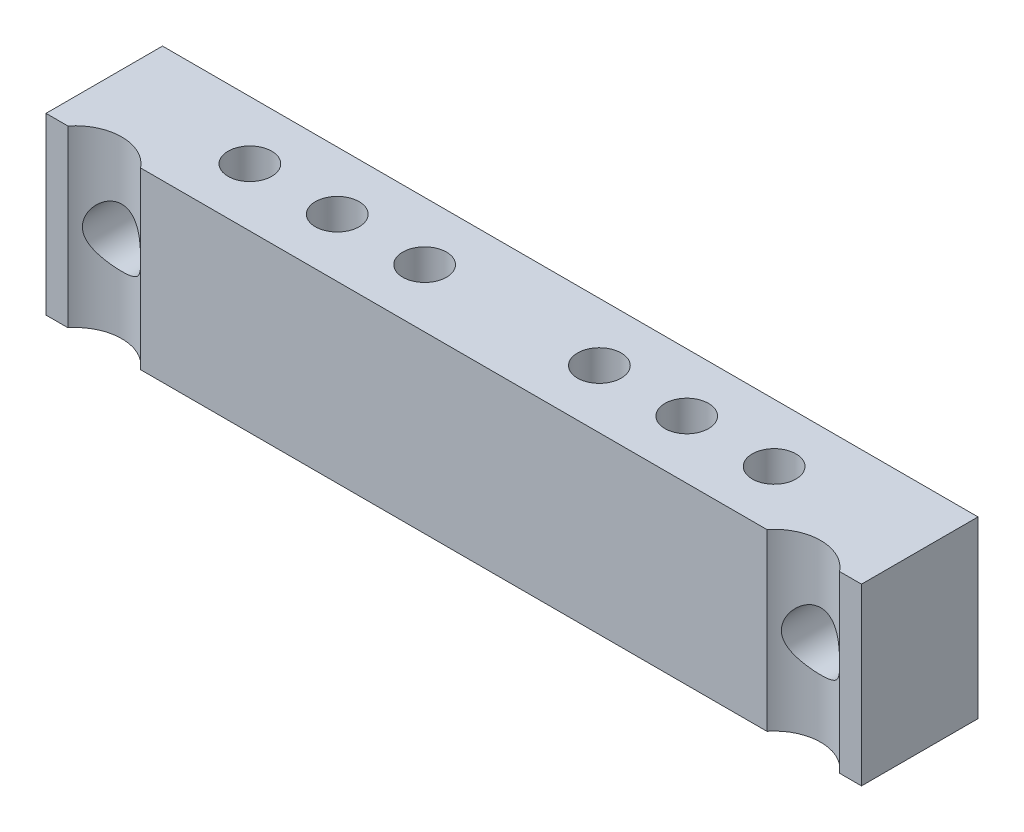
ISO-10303-21;
HEADER;
FILE_DESCRIPTION(('STEP AP214'),'2;1');
FILE_NAME('part.step','',(''),(''),'','','');
FILE_SCHEMA(('AUTOMOTIVE_DESIGN { 1 0 10303 214 1 1 1 1 }'));
ENDSEC;
DATA;
#1=APPLICATION_CONTEXT('core data for automotive mechanical design processes');
#2=APPLICATION_PROTOCOL_DEFINITION('international standard','automotive_design',2000,#1);
#3=PRODUCT_CONTEXT('',#1,'mechanical');
#4=PRODUCT('Part','Part','',(#3));
#5=PRODUCT_RELATED_PRODUCT_CATEGORY('part','',(#4));
#6=PRODUCT_DEFINITION_FORMATION('','',#4);
#7=PRODUCT_DEFINITION_CONTEXT('part definition',#1,'design');
#8=PRODUCT_DEFINITION('design','',#6,#7);
#9=PRODUCT_DEFINITION_SHAPE('','',#8);
#10=(LENGTH_UNIT() NAMED_UNIT(*) SI_UNIT(.MILLI.,.METRE.));
#11=(NAMED_UNIT(*) PLANE_ANGLE_UNIT() SI_UNIT($,.RADIAN.));
#12=(NAMED_UNIT(*) SI_UNIT($,.STERADIAN.) SOLID_ANGLE_UNIT());
#13=UNCERTAINTY_MEASURE_WITH_UNIT(LENGTH_MEASURE(1.E-05),#10,'distance_accuracy_value','');
#14=(GEOMETRIC_REPRESENTATION_CONTEXT(3) GLOBAL_UNCERTAINTY_ASSIGNED_CONTEXT((#13)) GLOBAL_UNIT_ASSIGNED_CONTEXT((#10,
#11,#12)) REPRESENTATION_CONTEXT('',''));
#15=CARTESIAN_POINT('',(0.,0.,0.));
#16=DIRECTION('',(0.,0.,1.));
#17=DIRECTION('',(1.,0.,0.));
#18=AXIS2_PLACEMENT_3D('',#15,#16,#17);
#19=CARTESIAN_POINT('',(0.,0.,4.));
#20=DIRECTION('',(0.,0.,-1.));
#21=DIRECTION('',(-1.,0.,0.));
#22=AXIS2_PLACEMENT_3D('',#19,#20,#21);
#23=PLANE('',#22);
#24=DIRECTION('',(-1.,0.,0.));
#25=VECTOR('',#24,1.);
#26=CARTESIAN_POINT('',(0.,6.,4.));
#27=LINE('',#26,#25);
#28=CARTESIAN_POINT('',(24.7510004003203,6.,4.));
#29=VERTEX_POINT('',#28);
#30=CARTESIAN_POINT('',(3.24899959967968,6.,4.));
#31=VERTEX_POINT('',#30);
#32=EDGE_CURVE('E119',#29,#31,#27,.T.);
#33=ORIENTED_EDGE('',*,*,#32,.T.);
#34=DIRECTION('',(0.,-1.,0.));
#35=VECTOR('',#34,1.);
#36=CARTESIAN_POINT('',(3.24899959967968,6.,4.));
#37=LINE('',#36,#35);
#38=CARTESIAN_POINT('',(3.24899959967968,0.,4.));
#39=VERTEX_POINT('',#38);
#40=EDGE_CURVE('E57',#31,#39,#37,.T.);
#41=ORIENTED_EDGE('',*,*,#40,.T.);
#42=DIRECTION('',(1.,0.,0.));
#43=VECTOR('',#42,1.);
#44=CARTESIAN_POINT('',(0.,0.,4.));
#45=LINE('',#44,#43);
#46=CARTESIAN_POINT('',(24.7510004003203,0.,4.));
#47=VERTEX_POINT('',#46);
#48=EDGE_CURVE('E121',#39,#47,#45,.T.);
#49=ORIENTED_EDGE('',*,*,#48,.T.);
#50=DIRECTION('',(0.,-1.,0.));
#51=VECTOR('',#50,1.);
#52=CARTESIAN_POINT('',(24.7510004003203,6.,4.));
#53=LINE('',#52,#51);
#54=EDGE_CURVE('E107',#47,#29,#53,.F.);
#55=ORIENTED_EDGE('',*,*,#54,.T.);
#56=EDGE_LOOP('',(#33,#41,#49,#55));
#57=FACE_BOUND('',#56,.T.);
#58=ADVANCED_FACE('F35',(#57),#23,.F.);
#59=CARTESIAN_POINT('',(28.,6.,4.));
#60=VERTEX_POINT('',#59);
#61=CARTESIAN_POINT('',(27.2489995996797,6.,4.));
#62=VERTEX_POINT('',#61);
#63=EDGE_CURVE('E127',#60,#62,#27,.T.);
#64=ORIENTED_EDGE('',*,*,#63,.T.);
#65=DIRECTION('',(0.,-1.,0.));
#66=VECTOR('',#65,1.);
#67=CARTESIAN_POINT('',(27.2489995996797,6.,4.));
#68=LINE('',#67,#66);
#69=CARTESIAN_POINT('',(27.2489995996797,0.,4.));
#70=VERTEX_POINT('',#69);
#71=EDGE_CURVE('E65',#62,#70,#68,.T.);
#72=ORIENTED_EDGE('',*,*,#71,.T.);
#73=CARTESIAN_POINT('',(28.,0.,4.));
#74=VERTEX_POINT('',#73);
#75=EDGE_CURVE('E215',#70,#74,#45,.T.);
#76=ORIENTED_EDGE('',*,*,#75,.T.);
#77=DIRECTION('',(0.,1.,0.));
#78=VECTOR('',#77,1.);
#79=CARTESIAN_POINT('',(28.,0.,4.));
#80=LINE('',#79,#78);
#81=EDGE_CURVE('E131',#74,#60,#80,.T.);
#82=ORIENTED_EDGE('',*,*,#81,.T.);
#83=EDGE_LOOP('',(#64,#72,#76,#82));
#84=FACE_BOUND('',#83,.T.);
#85=ADVANCED_FACE('F191',(#84),#23,.F.);
#86=CARTESIAN_POINT('',(0.,0.,4.));
#87=VERTEX_POINT('',#86);
#88=CARTESIAN_POINT('',(0.751000400320319,0.,4.));
#89=VERTEX_POINT('',#88);
#90=EDGE_CURVE('E209',#87,#89,#45,.T.);
#91=ORIENTED_EDGE('',*,*,#90,.T.);
#92=DIRECTION('',(0.,-1.,0.));
#93=VECTOR('',#92,1.);
#94=CARTESIAN_POINT('',(0.751000400320319,6.,4.));
#95=LINE('',#94,#93);
#96=CARTESIAN_POINT('',(0.751000400320319,6.,4.));
#97=VERTEX_POINT('',#96);
#98=EDGE_CURVE('E210',#89,#97,#95,.F.);
#99=ORIENTED_EDGE('',*,*,#98,.T.);
#100=CARTESIAN_POINT('',(0.,6.,4.));
#101=VERTEX_POINT('',#100);
#102=EDGE_CURVE('E128',#97,#101,#27,.T.);
#103=ORIENTED_EDGE('',*,*,#102,.T.);
#104=DIRECTION('',(0.,-1.,0.));
#105=VECTOR('',#104,1.);
#106=CARTESIAN_POINT('',(0.,0.,4.));
#107=LINE('',#106,#105);
#108=EDGE_CURVE('E145',#101,#87,#107,.T.);
#109=ORIENTED_EDGE('',*,*,#108,.T.);
#110=EDGE_LOOP('',(#91,#99,#103,#109));
#111=FACE_BOUND('',#110,.T.);
#112=ADVANCED_FACE('F193',(#111),#23,.F.);
#113=CARTESIAN_POINT('',(0.,0.,0.));
#114=DIRECTION('',(0.,0.,-1.));
#115=DIRECTION('',(-1.,0.,0.));
#116=AXIS2_PLACEMENT_3D('',#113,#114,#115);
#117=PLANE('',#116);
#118=CARTESIAN_POINT('',(2.,3.,0.));
#119=DIRECTION('',(0.,0.,1.));
#120=DIRECTION('',(1.,0.,0.));
#121=AXIS2_PLACEMENT_3D('',#118,#119,#120);
#122=CIRCLE('',#121,1.);
#123=CARTESIAN_POINT('',(3.,3.,0.));
#124=VERTEX_POINT('',#123);
#125=EDGE_CURVE('E139',#124,#124,#122,.T.);
#126=ORIENTED_EDGE('',*,*,#125,.T.);
#127=EDGE_LOOP('',(#126));
#128=FACE_BOUND('',#127,.T.);
#129=DIRECTION('',(0.,-1.,0.));
#130=VECTOR('',#129,1.);
#131=CARTESIAN_POINT('',(0.,0.,0.));
#132=LINE('',#131,#130);
#133=CARTESIAN_POINT('',(0.,6.,0.));
#134=VERTEX_POINT('',#133);
#135=CARTESIAN_POINT('',(0.,0.,0.));
#136=VERTEX_POINT('',#135);
#137=EDGE_CURVE('E135',#134,#136,#132,.T.);
#138=ORIENTED_EDGE('',*,*,#137,.F.);
#139=DIRECTION('',(-1.,0.,0.));
#140=VECTOR('',#139,1.);
#141=CARTESIAN_POINT('',(0.,6.,0.));
#142=LINE('',#141,#140);
#143=CARTESIAN_POINT('',(28.,6.,0.));
#144=VERTEX_POINT('',#143);
#145=EDGE_CURVE('E143',#144,#134,#142,.T.);
#146=ORIENTED_EDGE('',*,*,#145,.F.);
#147=DIRECTION('',(0.,1.,0.));
#148=VECTOR('',#147,1.);
#149=CARTESIAN_POINT('',(28.,0.,0.));
#150=LINE('',#149,#148);
#151=CARTESIAN_POINT('',(28.,0.,0.));
#152=VERTEX_POINT('',#151);
#153=EDGE_CURVE('E141',#152,#144,#150,.T.);
#154=ORIENTED_EDGE('',*,*,#153,.F.);
#155=DIRECTION('',(1.,0.,0.));
#156=VECTOR('',#155,1.);
#157=CARTESIAN_POINT('',(0.,0.,0.));
#158=LINE('',#157,#156);
#159=EDGE_CURVE('E138',#136,#152,#158,.T.);
#160=ORIENTED_EDGE('',*,*,#159,.F.);
#161=EDGE_LOOP('',(#138,#146,#154,#160));
#162=FACE_BOUND('',#161,.T.);
#163=CARTESIAN_POINT('',(26.,3.,0.));
#164=DIRECTION('',(0.,0.,1.));
#165=DIRECTION('',(-1.,0.,0.));
#166=AXIS2_PLACEMENT_3D('',#163,#164,#165);
#167=CIRCLE('',#166,1.);
#168=CARTESIAN_POINT('',(25.,3.,0.));
#169=VERTEX_POINT('',#168);
#170=EDGE_CURVE('E222',#169,#169,#167,.T.);
#171=ORIENTED_EDGE('',*,*,#170,.T.);
#172=EDGE_LOOP('',(#171));
#173=FACE_BOUND('',#172,.T.);
#174=ADVANCED_FACE('F200',(#128,#162,#173),#117,.T.);
#175=CARTESIAN_POINT('',(0.,0.,4.));
#176=DIRECTION('',(1.,0.,0.));
#177=DIRECTION('',(0.,0.,-1.));
#178=AXIS2_PLACEMENT_3D('',#175,#176,#177);
#179=PLANE('',#178);
#180=ORIENTED_EDGE('',*,*,#137,.T.);
#181=DIRECTION('',(0.,0.,-1.));
#182=VECTOR('',#181,1.);
#183=CARTESIAN_POINT('',(0.,0.,4.));
#184=LINE('',#183,#182);
#185=EDGE_CURVE('E11',#87,#136,#184,.T.);
#186=ORIENTED_EDGE('',*,*,#185,.F.);
#187=ORIENTED_EDGE('',*,*,#108,.F.);
#188=DIRECTION('',(0.,0.,-1.));
#189=VECTOR('',#188,1.);
#190=CARTESIAN_POINT('',(0.,6.,4.));
#191=LINE('',#190,#189);
#192=EDGE_CURVE('E130',#101,#134,#191,.T.);
#193=ORIENTED_EDGE('',*,*,#192,.T.);
#194=EDGE_LOOP('',(#180,#186,#187,#193));
#195=FACE_BOUND('',#194,.T.);
#196=ADVANCED_FACE('F37',(#195),#179,.F.);
#197=CARTESIAN_POINT('',(0.,0.,4.));
#198=DIRECTION('',(0.,1.,0.));
#199=DIRECTION('',(0.,0.,1.));
#200=AXIS2_PLACEMENT_3D('',#197,#198,#199);
#201=PLANE('',#200);
#202=CARTESIAN_POINT('',(17.,0.,2.));
#203=DIRECTION('',(0.,-1.,0.));
#204=DIRECTION('',(0.,0.,1.));
#205=AXIS2_PLACEMENT_3D('',#202,#203,#204);
#206=CIRCLE('',#205,0.750000000000002);
#207=CARTESIAN_POINT('',(17.,0.,2.75));
#208=VERTEX_POINT('',#207);
#209=EDGE_CURVE('E113',#208,#208,#206,.T.);
#210=ORIENTED_EDGE('',*,*,#209,.F.);
#211=EDGE_LOOP('',(#210));
#212=FACE_BOUND('',#211,.T.);
#213=CARTESIAN_POINT('',(20.,0.,1.99999999999998));
#214=DIRECTION('',(0.,-1.,0.));
#215=DIRECTION('',(0.,0.,1.));
#216=AXIS2_PLACEMENT_3D('',#213,#214,#215);
#217=CIRCLE('',#216,0.750000000000002);
#218=CARTESIAN_POINT('',(20.,0.,2.74999999999998));
#219=VERTEX_POINT('',#218);
#220=EDGE_CURVE('E260',#219,#219,#217,.T.);
#221=ORIENTED_EDGE('',*,*,#220,.F.);
#222=EDGE_LOOP('',(#221));
#223=FACE_BOUND('',#222,.T.);
#224=CARTESIAN_POINT('',(5.,0.,1.99999999999996));
#225=DIRECTION('',(0.,-1.,0.));
#226=DIRECTION('',(0.,0.,-1.));
#227=AXIS2_PLACEMENT_3D('',#224,#225,#226);
#228=CIRCLE('',#227,0.75);
#229=CARTESIAN_POINT('',(5.,0.,1.24999999999996));
#230=VERTEX_POINT('',#229);
#231=EDGE_CURVE('E228',#230,#230,#228,.T.);
#232=ORIENTED_EDGE('',*,*,#231,.F.);
#233=EDGE_LOOP('',(#232));
#234=FACE_BOUND('',#233,.T.);
#235=CARTESIAN_POINT('',(8.,0.,1.99999999999998));
#236=DIRECTION('',(0.,-1.,0.));
#237=DIRECTION('',(0.,0.,-1.));
#238=AXIS2_PLACEMENT_3D('',#235,#236,#237);
#239=CIRCLE('',#238,0.75);
#240=CARTESIAN_POINT('',(8.,0.,1.24999999999998));
#241=VERTEX_POINT('',#240);
#242=EDGE_CURVE('E235',#241,#241,#239,.T.);
#243=ORIENTED_EDGE('',*,*,#242,.F.);
#244=EDGE_LOOP('',(#243));
#245=FACE_BOUND('',#244,.T.);
#246=CARTESIAN_POINT('',(23.,0.,1.99999999999996));
#247=DIRECTION('',(0.,-1.,0.));
#248=DIRECTION('',(0.,0.,1.));
#249=AXIS2_PLACEMENT_3D('',#246,#247,#248);
#250=CIRCLE('',#249,0.750000000000002);
#251=CARTESIAN_POINT('',(23.,0.,2.74999999999996));
#252=VERTEX_POINT('',#251);
#253=EDGE_CURVE('E241',#252,#252,#250,.T.);
#254=ORIENTED_EDGE('',*,*,#253,.F.);
#255=EDGE_LOOP('',(#254));
#256=FACE_BOUND('',#255,.T.);
#257=CARTESIAN_POINT('',(11.,0.,2.));
#258=DIRECTION('',(0.,-1.,0.));
#259=DIRECTION('',(0.,0.,-1.));
#260=AXIS2_PLACEMENT_3D('',#257,#258,#259);
#261=CIRCLE('',#260,0.75);
#262=CARTESIAN_POINT('',(11.,0.,1.25));
#263=VERTEX_POINT('',#262);
#264=EDGE_CURVE('E247',#263,#263,#261,.T.);
#265=ORIENTED_EDGE('',*,*,#264,.F.);
#266=EDGE_LOOP('',(#265));
#267=FACE_BOUND('',#266,.T.);
#268=ORIENTED_EDGE('',*,*,#48,.F.);
#269=CARTESIAN_POINT('',(2.,0.,5.));
#270=DIRECTION('',(0.,-1.,0.));
#271=DIRECTION('',(0.,0.,-1.));
#272=AXIS2_PLACEMENT_3D('',#269,#270,#271);
#273=CIRCLE('',#272,1.6);
#274=EDGE_CURVE('E253',#89,#39,#273,.T.);
#275=ORIENTED_EDGE('',*,*,#274,.F.);
#276=ORIENTED_EDGE('',*,*,#90,.F.);
#277=ORIENTED_EDGE('',*,*,#185,.T.);
#278=ORIENTED_EDGE('',*,*,#159,.T.);
#279=DIRECTION('',(0.,0.,-1.));
#280=VECTOR('',#279,1.);
#281=CARTESIAN_POINT('',(28.,0.,4.));
#282=LINE('',#281,#280);
#283=EDGE_CURVE('E49',#74,#152,#282,.T.);
#284=ORIENTED_EDGE('',*,*,#283,.F.);
#285=ORIENTED_EDGE('',*,*,#75,.F.);
#286=CARTESIAN_POINT('',(26.,0.,5.));
#287=DIRECTION('',(0.,-1.,0.));
#288=DIRECTION('',(0.,0.,1.));
#289=AXIS2_PLACEMENT_3D('',#286,#287,#288);
#290=CIRCLE('',#289,1.6);
#291=EDGE_CURVE('E114',#47,#70,#290,.T.);
#292=ORIENTED_EDGE('',*,*,#291,.F.);
#293=EDGE_LOOP('',(#268,#275,#276,#277,#278,#284,#285,#292));
#294=FACE_BOUND('',#293,.T.);
#295=ADVANCED_FACE('F266',(#212,#223,#234,#245,#256,#267,#294),#201,.F.);
#296=CARTESIAN_POINT('',(28.,0.,4.));
#297=DIRECTION('',(-1.,0.,0.));
#298=DIRECTION('',(0.,0.,1.));
#299=AXIS2_PLACEMENT_3D('',#296,#297,#298);
#300=PLANE('',#299);
#301=ORIENTED_EDGE('',*,*,#153,.T.);
#302=DIRECTION('',(0.,0.,-1.));
#303=VECTOR('',#302,1.);
#304=CARTESIAN_POINT('',(28.,6.,4.));
#305=LINE('',#304,#303);
#306=EDGE_CURVE('E148',#60,#144,#305,.T.);
#307=ORIENTED_EDGE('',*,*,#306,.F.);
#308=ORIENTED_EDGE('',*,*,#81,.F.);
#309=ORIENTED_EDGE('',*,*,#283,.T.);
#310=EDGE_LOOP('',(#301,#307,#308,#309));
#311=FACE_BOUND('',#310,.T.);
#312=ADVANCED_FACE('F277',(#311),#300,.F.);
#313=CARTESIAN_POINT('',(0.,6.,4.));
#314=DIRECTION('',(0.,-1.,0.));
#315=DIRECTION('',(1.,0.,0.));
#316=AXIS2_PLACEMENT_3D('',#313,#314,#315);
#317=PLANE('',#316);
#318=CARTESIAN_POINT('',(17.,6.,2.));
#319=DIRECTION('',(0.,-1.,0.));
#320=DIRECTION('',(0.,0.,1.));
#321=AXIS2_PLACEMENT_3D('',#318,#319,#320);
#322=CIRCLE('',#321,0.750000000000002);
#323=CARTESIAN_POINT('',(17.,6.,2.75));
#324=VERTEX_POINT('',#323);
#325=EDGE_CURVE('E257',#324,#324,#322,.T.);
#326=ORIENTED_EDGE('',*,*,#325,.T.);
#327=EDGE_LOOP('',(#326));
#328=FACE_BOUND('',#327,.T.);
#329=CARTESIAN_POINT('',(20.,6.,1.99999999999998));
#330=DIRECTION('',(0.,-1.,0.));
#331=DIRECTION('',(0.,0.,1.));
#332=AXIS2_PLACEMENT_3D('',#329,#330,#331);
#333=CIRCLE('',#332,0.750000000000002);
#334=CARTESIAN_POINT('',(20.,6.,2.74999999999998));
#335=VERTEX_POINT('',#334);
#336=EDGE_CURVE('E232',#335,#335,#333,.T.);
#337=ORIENTED_EDGE('',*,*,#336,.T.);
#338=EDGE_LOOP('',(#337));
#339=FACE_BOUND('',#338,.T.);
#340=CARTESIAN_POINT('',(5.,6.,1.99999999999996));
#341=DIRECTION('',(0.,-1.,0.));
#342=DIRECTION('',(0.,0.,-1.));
#343=AXIS2_PLACEMENT_3D('',#340,#341,#342);
#344=CIRCLE('',#343,0.75);
#345=CARTESIAN_POINT('',(5.,6.,1.24999999999996));
#346=VERTEX_POINT('',#345);
#347=EDGE_CURVE('E231',#346,#346,#344,.T.);
#348=ORIENTED_EDGE('',*,*,#347,.T.);
#349=EDGE_LOOP('',(#348));
#350=FACE_BOUND('',#349,.T.);
#351=CARTESIAN_POINT('',(8.,6.,1.99999999999998));
#352=DIRECTION('',(0.,-1.,0.));
#353=DIRECTION('',(0.,0.,-1.));
#354=AXIS2_PLACEMENT_3D('',#351,#352,#353);
#355=CIRCLE('',#354,0.75);
#356=CARTESIAN_POINT('',(8.,6.,1.24999999999998));
#357=VERTEX_POINT('',#356);
#358=EDGE_CURVE('E238',#357,#357,#355,.T.);
#359=ORIENTED_EDGE('',*,*,#358,.T.);
#360=EDGE_LOOP('',(#359));
#361=FACE_BOUND('',#360,.T.);
#362=CARTESIAN_POINT('',(23.,6.,1.99999999999996));
#363=DIRECTION('',(0.,-1.,0.));
#364=DIRECTION('',(0.,0.,1.));
#365=AXIS2_PLACEMENT_3D('',#362,#363,#364);
#366=CIRCLE('',#365,0.750000000000002);
#367=CARTESIAN_POINT('',(23.,6.,2.74999999999996));
#368=VERTEX_POINT('',#367);
#369=EDGE_CURVE('E244',#368,#368,#366,.T.);
#370=ORIENTED_EDGE('',*,*,#369,.T.);
#371=EDGE_LOOP('',(#370));
#372=FACE_BOUND('',#371,.T.);
#373=CARTESIAN_POINT('',(11.,6.,2.));
#374=DIRECTION('',(0.,-1.,0.));
#375=DIRECTION('',(0.,0.,-1.));
#376=AXIS2_PLACEMENT_3D('',#373,#374,#375);
#377=CIRCLE('',#376,0.75);
#378=CARTESIAN_POINT('',(11.,6.,1.25));
#379=VERTEX_POINT('',#378);
#380=EDGE_CURVE('E250',#379,#379,#377,.T.);
#381=ORIENTED_EDGE('',*,*,#380,.T.);
#382=EDGE_LOOP('',(#381));
#383=FACE_BOUND('',#382,.T.);
#384=ORIENTED_EDGE('',*,*,#102,.F.);
#385=CARTESIAN_POINT('',(2.,6.,5.));
#386=DIRECTION('',(0.,-1.,0.));
#387=DIRECTION('',(0.,0.,-1.));
#388=AXIS2_PLACEMENT_3D('',#385,#386,#387);
#389=CIRCLE('',#388,1.6);
#390=EDGE_CURVE('E126',#97,#31,#389,.T.);
#391=ORIENTED_EDGE('',*,*,#390,.T.);
#392=ORIENTED_EDGE('',*,*,#32,.F.);
#393=CARTESIAN_POINT('',(26.,6.,5.));
#394=DIRECTION('',(0.,-1.,0.));
#395=DIRECTION('',(0.,0.,1.));
#396=AXIS2_PLACEMENT_3D('',#393,#394,#395);
#397=CIRCLE('',#396,1.6);
#398=EDGE_CURVE('E104',#29,#62,#397,.T.);
#399=ORIENTED_EDGE('',*,*,#398,.T.);
#400=ORIENTED_EDGE('',*,*,#63,.F.);
#401=ORIENTED_EDGE('',*,*,#306,.T.);
#402=ORIENTED_EDGE('',*,*,#145,.T.);
#403=ORIENTED_EDGE('',*,*,#192,.F.);
#404=EDGE_LOOP('',(#384,#391,#392,#399,#400,#401,#402,#403));
#405=FACE_BOUND('',#404,.T.);
#406=ADVANCED_FACE('F125',(#328,#339,#350,#361,#372,#383,#405),#317,.F.);
#407=CARTESIAN_POINT('',(2.,3.,4.));
#408=DIRECTION('',(0.,0.,-1.));
#409=DIRECTION('',(-1.,0.,0.));
#410=AXIS2_PLACEMENT_3D('',#407,#408,#409);
#411=CYLINDRICAL_SURFACE('',#410,1.);
#412=CARTESIAN_POINT('',(1.,3.,3.75100040032032));
#413=CARTESIAN_POINT('',(1.00000430231612,3.04969622544234,3.75099359941953));
#414=CARTESIAN_POINT('',(1.00373844920268,3.0994702682962,3.7479788583293));
#415=CARTESIAN_POINT('',(1.01840839333653,3.1973410560635,3.73645026235617));
#416=CARTESIAN_POINT('',(1.02936375655559,3.24543286909219,3.72792146828708));
#417=CARTESIAN_POINT('',(1.05769540870503,3.33822585815907,3.70679931736767));
#418=CARTESIAN_POINT('',(1.07501605333772,3.38295248694545,3.69424130065573));
#419=CARTESIAN_POINT('',(1.11542443550461,3.46880708931052,3.66653639428454));
#420=CARTESIAN_POINT('',(1.13851233035127,3.5099349646852,3.65138943401059));
#421=CARTESIAN_POINT('',(1.19340849657309,3.59349212358158,3.61776310900231));
#422=CARTESIAN_POINT('',(1.225971125046,3.63535579266607,3.59910929418123));
#423=CARTESIAN_POINT('',(1.2973530684025,3.71350615931597,3.56197743316098));
#424=CARTESIAN_POINT('',(1.33617777496207,3.74978799782714,3.54349955309336));
#425=CARTESIAN_POINT('',(1.42465066779321,3.8200828681185,3.50616436887192));
#426=CARTESIAN_POINT('',(1.47503954487155,3.85329413448344,3.4875302220684));
#427=CARTESIAN_POINT('',(1.58207674333015,3.91050016381053,3.45453414640688));
#428=CARTESIAN_POINT('',(1.63871879481741,3.934504052601,3.4401679905613));
#429=CARTESIAN_POINT('',(1.75057849731039,3.96998584848565,3.41864126945439));
#430=CARTESIAN_POINT('',(1.80535549116221,3.98248913311755,3.41089662062369));
#431=CARTESIAN_POINT('',(1.91671591947019,3.99810565571472,3.40119564496638));
#432=CARTESIAN_POINT('',(1.97329739154878,4.00122876489644,3.39923323325074));
#433=CARTESIAN_POINT('',(2.07845266273707,3.99811544857791,3.40117672713978));
#434=CARTESIAN_POINT('',(2.12708201861903,3.99307889895928,3.40433040150478));
#435=CARTESIAN_POINT('',(2.22264531672294,3.97610641250934,3.4148378219102));
#436=CARTESIAN_POINT('',(2.26957913051758,3.96416995420999,3.42219188539906));
#437=CARTESIAN_POINT('',(2.36071129366166,3.93391697992231,3.4404949310826));
#438=CARTESIAN_POINT('',(2.40490230039459,3.91558414076113,3.4514531066087));
#439=CARTESIAN_POINT('',(2.48961537637551,3.87322499579201,3.47611493688535));
#440=CARTESIAN_POINT('',(2.530136606848,3.84919739288752,3.48981921700619));
#441=CARTESIAN_POINT('',(2.61177081245363,3.79277746773651,3.52085420199365));
#442=CARTESIAN_POINT('',(2.65232987593516,3.75971629860613,3.53842396554284));
#443=CARTESIAN_POINT('',(2.7276788767244,3.6878940958213,3.5744362979821));
#444=CARTESIAN_POINT('',(2.76246027103171,3.64912477884276,3.59288010840663));
#445=CARTESIAN_POINT('',(2.82988356714345,3.56103550167512,3.63142846310243));
#446=CARTESIAN_POINT('',(2.86165292383957,3.51099889531976,3.65143534773444));
#447=CARTESIAN_POINT('',(2.91620922562647,3.40508310418126,3.6878868872368));
#448=CARTESIAN_POINT('',(2.93901271682686,3.34921492483567,3.70433807846656));
#449=CARTESIAN_POINT('',(2.96974853482533,3.2481844776897,3.72726498746304));
#450=CARTESIAN_POINT('',(2.98001473377377,3.20407122988986,3.73522636555782));
#451=CARTESIAN_POINT('',(2.99448134830019,3.11430784900085,3.74656688899388));
#452=CARTESIAN_POINT('',(2.9986900508262,3.06865990316808,3.74995229410057));
#453=CARTESIAN_POINT('',(3.00078828763607,2.97701705556779,3.75163093175868));
#454=CARTESIAN_POINT('',(2.99866334061261,2.93102159890735,3.74991249487652));
#455=CARTESIAN_POINT('',(2.9882058684479,2.84017553517472,3.74163165709836));
#456=CARTESIAN_POINT('',(2.9798682025621,2.79532590802966,3.73506524476275));
#457=CARTESIAN_POINT('',(2.95763948579864,2.70862529290736,3.71815951518434));
#458=CARTESIAN_POINT('',(2.94384224501431,2.66673706133479,3.70788417650263));
#459=CARTESIAN_POINT('',(2.91121961550818,2.58577013235442,3.68467541247327));
#460=CARTESIAN_POINT('',(2.89239244217137,2.54669243838041,3.67174104408073));
#461=CARTESIAN_POINT('',(2.84612301417856,2.46455516865838,3.6417023680885));
#462=CARTESIAN_POINT('',(2.81772299051377,2.42215396700054,3.62427299409368));
#463=CARTESIAN_POINT('',(2.75495221057989,2.34225195804868,3.58884833599431));
#464=CARTESIAN_POINT('',(2.72057525959728,2.30475630641763,3.57085248077317));
#465=CARTESIAN_POINT('',(2.64030452759936,2.22961340300548,3.53293468784822));
#466=CARTESIAN_POINT('',(2.59344795977133,2.19290515439386,3.51316636169922));
#467=CARTESIAN_POINT('',(2.49303999029566,2.12794507849932,3.47692600828));
#468=CARTESIAN_POINT('',(2.43949174299893,2.09968928802109,3.46045243736694));
#469=CARTESIAN_POINT('',(2.33034072050928,2.05440400703789,3.43352595233951));
#470=CARTESIAN_POINT('',(2.27505185803562,2.03680463482339,3.42277212328656));
#471=CARTESIAN_POINT('',(2.1614887991078,2.01141866505513,3.40714391929568));
#472=CARTESIAN_POINT('',(2.10321885059069,2.00361848819111,3.40226140853597));
#473=CARTESIAN_POINT('',(1.99472074240255,1.99876278396897,3.39922651401153));
#474=CARTESIAN_POINT('',(1.94457496192362,2.00029137857041,3.40018719501106));
#475=CARTESIAN_POINT('',(1.84537615112662,2.01076933997947,3.40671408032982));
#476=CARTESIAN_POINT('',(1.79632307132741,2.01971837006061,3.41228007566785));
#477=CARTESIAN_POINT('',(1.70236536425158,2.04412837990128,3.42723116248816));
#478=CARTESIAN_POINT('',(1.65737585545735,2.05935267189856,3.43647706022639));
#479=CARTESIAN_POINT('',(1.57062850471095,2.09564794253125,3.45804025058188));
#480=CARTESIAN_POINT('',(1.52887120950541,2.11671990758047,3.47035806134875));
#481=CARTESIAN_POINT('',(1.44507461002347,2.16652846319296,3.4985972620814));
#482=CARTESIAN_POINT('',(1.40345589827023,2.19583358505518,3.51475998026435));
#483=CARTESIAN_POINT('',(1.32542671331567,2.26006130426616,3.5485308763501));
#484=CARTESIAN_POINT('',(1.28902220555582,2.29499024019675,3.56614067415503));
#485=CARTESIAN_POINT('',(1.21702111895936,2.37529300984262,3.6039966792038));
#486=CARTESIAN_POINT('',(1.18229736100947,2.42144667614153,3.62425702842949));
#487=CARTESIAN_POINT('',(1.12098139995405,2.51971573280809,3.6626014280237));
#488=CARTESIAN_POINT('',(1.0943846995432,2.57182780392608,3.68068667866359));
#489=CARTESIAN_POINT('',(1.05520711261415,2.66912221434373,3.70856179135829));
#490=CARTESIAN_POINT('',(1.04083026978895,2.71330854470349,3.71930127720278));
#491=CARTESIAN_POINT('',(1.01829742255674,2.80397542236575,3.73648673249648));
#492=CARTESIAN_POINT('',(1.01012172603676,2.85044820401931,3.74294628479859));
#493=CARTESIAN_POINT('',(1.00352075053522,2.91442441909028,3.74818834888485));
#494=CARTESIAN_POINT('',(1.00220262992335,2.93149131641359,3.74923944362538));
#495=CARTESIAN_POINT('',(1.0004414021257,2.96570237321719,3.75064673043963));
#496=CARTESIAN_POINT('',(0.999998514986615,2.98284655104135,3.75100274776026));
#497=CARTESIAN_POINT('',(1.,3.,3.75100040032032));
#498=B_SPLINE_CURVE_WITH_KNOTS('',3,(#412,#413,#414,#415,#416,#417,#418,#419,#420,#421,#422,
#423,#424,#425,#426,#427,#428,#429,#430,#431,#432,#433,#434,#435,#436,#437,#438,#439,#440,#441,
#442,#443,#444,#445,#446,#447,#448,#449,#450,#451,#452,#453,#454,#455,#456,#457,#458,#459,#460,
#461,#462,#463,#464,#465,#466,#467,#468,#469,#470,#471,#472,#473,#474,#475,#476,#477,#478,#479,
#480,#481,#482,#483,#484,#485,#486,#487,#488,#489,#490,#491,#492,#493,#494,#495,#496,#497),
.UNSPECIFIED.,.T.,.F.,(4,2,2,2,2,2,2,2,2,2,2,2,2,2,2,2,2,2,2,2,2,2,2,2,2,2,2,2,2,2,2,2,2,2,2,2,
2,2,2,2,2,2,4),(0.,0.149009955209611,0.298425323517676,0.446564444904321,0.5947076075022,
0.762724965952059,0.930887767983289,1.11933788827565,1.30760074191408,1.47672330252318,
1.6456678247391,1.79193855666809,1.93822034461131,2.08487819860765,2.23156948902537,
2.39651603865686,2.56170435212949,2.74846454336657,2.93487844076222,3.07226220384214,
3.20945784005832,3.34696740192591,3.48459087328065,3.61994569874879,3.75534861189708,
3.91653066888103,4.07788078788203,4.26509278928711,4.452216872493,4.62816064395639,
4.80386033007169,4.95362881220099,5.10339049846866,5.24795655291539,5.39254700830304,
5.55214515286996,5.71192445567094,5.89473453936999,6.07744327668309,6.2199752181633,
6.36205262370708,6.41347287255598,6.46490604757618),.UNSPECIFIED.);
#499=CARTESIAN_POINT('',(1.,3.,3.75100040032032));
#500=VERTEX_POINT('',#499);
#501=EDGE_CURVE('E39',#500,#500,#498,.T.);
#502=ORIENTED_EDGE('',*,*,#501,.F.);
#503=EDGE_LOOP('',(#502));
#504=FACE_BOUND('',#503,.T.);
#505=ORIENTED_EDGE('',*,*,#125,.F.);
#506=EDGE_LOOP('',(#505));
#507=FACE_BOUND('',#506,.T.);
#508=ADVANCED_FACE('F284',(#504,#507),#411,.F.);
#509=CARTESIAN_POINT('',(26.,3.,4.));
#510=DIRECTION('',(0.,0.,-1.));
#511=DIRECTION('',(-1.,0.,0.));
#512=AXIS2_PLACEMENT_3D('',#509,#510,#511);
#513=CYLINDRICAL_SURFACE('',#512,1.);
#514=CARTESIAN_POINT('',(25.,3.,3.75100040032032));
#515=CARTESIAN_POINT('',(25.0000043023161,3.04969622544235,3.75099359941953));
#516=CARTESIAN_POINT('',(25.0037384492027,3.09947026829621,3.7479788583293));
#517=CARTESIAN_POINT('',(25.0184083933365,3.19734105606351,3.73645026235618));
#518=CARTESIAN_POINT('',(25.0293637565556,3.24543286909219,3.72792146828708));
#519=CARTESIAN_POINT('',(25.057695408705,3.33822585815908,3.70679931736767));
#520=CARTESIAN_POINT('',(25.0750160533377,3.38295248694545,3.69424130065573));
#521=CARTESIAN_POINT('',(25.1154244355046,3.46880708931053,3.66653639428454));
#522=CARTESIAN_POINT('',(25.1385123303513,3.50993496468521,3.65138943401059));
#523=CARTESIAN_POINT('',(25.1934084965731,3.59349212358159,3.61776310900231));
#524=CARTESIAN_POINT('',(25.225971125046,3.63535579266608,3.59910929418123));
#525=CARTESIAN_POINT('',(25.2973530684025,3.71350615931598,3.56197743316099));
#526=CARTESIAN_POINT('',(25.3361777749621,3.74978799782714,3.54349955309337));
#527=CARTESIAN_POINT('',(25.4246506677932,3.8200828681185,3.50616436887192));
#528=CARTESIAN_POINT('',(25.4750395448716,3.85329413448345,3.4875302220684));
#529=CARTESIAN_POINT('',(25.5820767433301,3.91050016381053,3.45453414640688));
#530=CARTESIAN_POINT('',(25.6387187948174,3.93450405260101,3.4401679905613));
#531=CARTESIAN_POINT('',(25.7505784973104,3.96998584848565,3.41864126945439));
#532=CARTESIAN_POINT('',(25.8053554911622,3.98248913311755,3.41089662062369));
#533=CARTESIAN_POINT('',(25.9167159194702,3.99810565571473,3.40119564496638));
#534=CARTESIAN_POINT('',(25.9732973915488,4.00122876489645,3.39923323325074));
#535=CARTESIAN_POINT('',(26.0784526627371,3.99811544857792,3.40117672713978));
#536=CARTESIAN_POINT('',(26.127082018619,3.99307889895928,3.40433040150478));
#537=CARTESIAN_POINT('',(26.2226453167229,3.97610641250935,3.4148378219102));
#538=CARTESIAN_POINT('',(26.2695791305176,3.96416995420999,3.42219188539906));
#539=CARTESIAN_POINT('',(26.3607112936617,3.93391697992231,3.4404949310826));
#540=CARTESIAN_POINT('',(26.4049023003946,3.91558414076113,3.4514531066087));
#541=CARTESIAN_POINT('',(26.4896153763755,3.87322499579201,3.47611493688535));
#542=CARTESIAN_POINT('',(26.530136606848,3.84919739288752,3.48981921700619));
#543=CARTESIAN_POINT('',(26.6117708124536,3.79277746773651,3.52085420199365));
#544=CARTESIAN_POINT('',(26.6523298759352,3.75971629860614,3.53842396554284));
#545=CARTESIAN_POINT('',(26.7276788767244,3.68789409582131,3.5744362979821));
#546=CARTESIAN_POINT('',(26.7624602710317,3.64912477884277,3.59288010840663));
#547=CARTESIAN_POINT('',(26.8298835671435,3.56103550167512,3.63142846310243));
#548=CARTESIAN_POINT('',(26.8616529238396,3.51099889531976,3.65143534773444));
#549=CARTESIAN_POINT('',(26.9162092256265,3.40508310418126,3.6878868872368));
#550=CARTESIAN_POINT('',(26.9390127168269,3.34921492483567,3.70433807846656));
#551=CARTESIAN_POINT('',(26.9697485348253,3.2481844776897,3.72726498746304));
#552=CARTESIAN_POINT('',(26.9800147337738,3.20407122988987,3.73522636555782));
#553=CARTESIAN_POINT('',(26.9944813483002,3.11430784900086,3.74656688899388));
#554=CARTESIAN_POINT('',(26.9986900508262,3.06865990316809,3.74995229410057));
#555=CARTESIAN_POINT('',(27.0007882876361,2.97701705556779,3.75163093175869));
#556=CARTESIAN_POINT('',(26.9986633406126,2.93102159890735,3.74991249487652));
#557=CARTESIAN_POINT('',(26.9882058684479,2.84017553517472,3.74163165709836));
#558=CARTESIAN_POINT('',(26.9798682025621,2.79532590802967,3.73506524476275));
#559=CARTESIAN_POINT('',(26.9576394857986,2.70862529290736,3.71815951518434));
#560=CARTESIAN_POINT('',(26.9438422450143,2.66673706133479,3.70788417650263));
#561=CARTESIAN_POINT('',(26.9112196155082,2.58577013235442,3.68467541247327));
#562=CARTESIAN_POINT('',(26.8923924421714,2.54669243838041,3.67174104408073));
#563=CARTESIAN_POINT('',(26.8461230141786,2.46455516865838,3.6417023680885));
#564=CARTESIAN_POINT('',(26.8177229905138,2.42215396700054,3.62427299409368));
#565=CARTESIAN_POINT('',(26.7549522105799,2.34225195804868,3.58884833599431));
#566=CARTESIAN_POINT('',(26.7205752595973,2.30475630641763,3.57085248077317));
#567=CARTESIAN_POINT('',(26.6403045275994,2.22961340300548,3.53293468784822));
#568=CARTESIAN_POINT('',(26.5934479597713,2.19290515439386,3.51316636169922));
#569=CARTESIAN_POINT('',(26.4930399902957,2.12794507849932,3.47692600828001));
#570=CARTESIAN_POINT('',(26.4394917429989,2.09968928802109,3.46045243736694));
#571=CARTESIAN_POINT('',(26.3303407205093,2.05440400703789,3.43352595233951));
#572=CARTESIAN_POINT('',(26.2750518580356,2.03680463482339,3.42277212328656));
#573=CARTESIAN_POINT('',(26.1614887991078,2.01141866505513,3.40714391929568));
#574=CARTESIAN_POINT('',(26.1032188505907,2.00361848819111,3.40226140853597));
#575=CARTESIAN_POINT('',(25.9947207424026,1.99876278396897,3.39922651401153));
#576=CARTESIAN_POINT('',(25.9445749619236,2.00029137857041,3.40018719501106));
#577=CARTESIAN_POINT('',(25.8453761511266,2.01076933997947,3.40671408032982));
#578=CARTESIAN_POINT('',(25.7963230713274,2.01971837006062,3.41228007566785));
#579=CARTESIAN_POINT('',(25.7023653642516,2.04412837990128,3.42723116248816));
#580=CARTESIAN_POINT('',(25.6573758554574,2.05935267189856,3.43647706022639));
#581=CARTESIAN_POINT('',(25.570628504711,2.09564794253125,3.45804025058188));
#582=CARTESIAN_POINT('',(25.5288712095054,2.11671990758047,3.47035806134875));
#583=CARTESIAN_POINT('',(25.4450746100235,2.16652846319296,3.4985972620814));
#584=CARTESIAN_POINT('',(25.4034558982702,2.19583358505519,3.51475998026435));
#585=CARTESIAN_POINT('',(25.3254267133157,2.26006130426616,3.5485308763501));
#586=CARTESIAN_POINT('',(25.2890222055558,2.29499024019676,3.56614067415503));
#587=CARTESIAN_POINT('',(25.2170211189594,2.37529300984262,3.6039966792038));
#588=CARTESIAN_POINT('',(25.1822973610095,2.42144667614153,3.62425702842949));
#589=CARTESIAN_POINT('',(25.1209813999541,2.5197157328081,3.66260142802371));
#590=CARTESIAN_POINT('',(25.0943846995432,2.57182780392608,3.68068667866359));
#591=CARTESIAN_POINT('',(25.0552071126142,2.66912221434374,3.70856179135829));
#592=CARTESIAN_POINT('',(25.040830269789,2.71330854470349,3.71930127720278));
#593=CARTESIAN_POINT('',(25.0182974225567,2.80397542236576,3.73648673249648));
#594=CARTESIAN_POINT('',(25.0101217260368,2.85044820401932,3.74294628479859));
#595=CARTESIAN_POINT('',(25.0035207505352,2.91442441909028,3.74818834888485));
#596=CARTESIAN_POINT('',(25.0022026299234,2.93149131641359,3.74923944362538));
#597=CARTESIAN_POINT('',(25.0004414021257,2.96570237321719,3.75064673043963));
#598=CARTESIAN_POINT('',(24.9999985149866,2.98284655104135,3.75100274776026));
#599=CARTESIAN_POINT('',(25.,3.,3.75100040032032));
#600=B_SPLINE_CURVE_WITH_KNOTS('',3,(#514,#515,#516,#517,#518,#519,#520,#521,#522,#523,#524,
#525,#526,#527,#528,#529,#530,#531,#532,#533,#534,#535,#536,#537,#538,#539,#540,#541,#542,#543,
#544,#545,#546,#547,#548,#549,#550,#551,#552,#553,#554,#555,#556,#557,#558,#559,#560,#561,#562,
#563,#564,#565,#566,#567,#568,#569,#570,#571,#572,#573,#574,#575,#576,#577,#578,#579,#580,#581,
#582,#583,#584,#585,#586,#587,#588,#589,#590,#591,#592,#593,#594,#595,#596,#597,#598,#599),
.UNSPECIFIED.,.T.,.F.,(4,2,2,2,2,2,2,2,2,2,2,2,2,2,2,2,2,2,2,2,2,2,2,2,2,2,2,2,2,2,2,2,2,2,2,2,
2,2,2,2,2,2,4),(0.,0.149009955209612,0.298425323517677,0.446564444904321,0.5947076075022,
0.762724965952062,0.93088776798329,1.11933788827566,1.30760074191409,1.47672330252318,
1.6456678247391,1.79193855666809,1.93822034461132,2.08487819860766,2.23156948902538,
2.39651603865686,2.56170435212949,2.74846454336657,2.93487844076222,3.07226220384214,
3.20945784005832,3.34696740192592,3.48459087328065,3.61994569874879,3.75534861189709,
3.91653066888103,4.07788078788203,4.26509278928712,4.45221687249301,4.6281606439564,
4.8038603300717,4.95362881220099,5.10339049846867,5.2479565529154,5.39254700830305,
5.55214515286997,5.71192445567094,5.89473453936999,6.0774432766831,6.21997521816331,
6.36205262370709,6.41347287255599,6.46490604757619),.UNSPECIFIED.);
#601=CARTESIAN_POINT('',(25.,3.,3.75100040032032));
#602=VERTEX_POINT('',#601);
#603=EDGE_CURVE('E122',#602,#602,#600,.T.);
#604=ORIENTED_EDGE('',*,*,#603,.F.);
#605=EDGE_LOOP('',(#604));
#606=FACE_BOUND('',#605,.T.);
#607=ORIENTED_EDGE('',*,*,#170,.F.);
#608=EDGE_LOOP('',(#607));
#609=FACE_BOUND('',#608,.T.);
#610=ADVANCED_FACE('F158',(#606,#609),#513,.F.);
#611=CARTESIAN_POINT('',(26.,6.,5.));
#612=DIRECTION('',(0.,-1.,0.));
#613=DIRECTION('',(0.,0.,-1.));
#614=AXIS2_PLACEMENT_3D('',#611,#612,#613);
#615=CYLINDRICAL_SURFACE('',#614,1.6);
#616=ORIENTED_EDGE('',*,*,#603,.T.);
#617=EDGE_LOOP('',(#616));
#618=FACE_BOUND('',#617,.T.);
#619=ORIENTED_EDGE('',*,*,#398,.F.);
#620=ORIENTED_EDGE('',*,*,#54,.F.);
#621=ORIENTED_EDGE('',*,*,#291,.T.);
#622=ORIENTED_EDGE('',*,*,#71,.F.);
#623=EDGE_LOOP('',(#619,#620,#621,#622));
#624=FACE_BOUND('',#623,.T.);
#625=ADVANCED_FACE('F106',(#618,#624),#615,.F.);
#626=CARTESIAN_POINT('',(2.,6.,5.));
#627=DIRECTION('',(0.,-1.,0.));
#628=DIRECTION('',(0.,0.,-1.));
#629=AXIS2_PLACEMENT_3D('',#626,#627,#628);
#630=CYLINDRICAL_SURFACE('',#629,1.6);
#631=ORIENTED_EDGE('',*,*,#501,.T.);
#632=EDGE_LOOP('',(#631));
#633=FACE_BOUND('',#632,.T.);
#634=ORIENTED_EDGE('',*,*,#390,.F.);
#635=ORIENTED_EDGE('',*,*,#98,.F.);
#636=ORIENTED_EDGE('',*,*,#274,.T.);
#637=ORIENTED_EDGE('',*,*,#40,.F.);
#638=EDGE_LOOP('',(#634,#635,#636,#637));
#639=FACE_BOUND('',#638,.T.);
#640=ADVANCED_FACE('F165',(#633,#639),#630,.F.);
#641=CARTESIAN_POINT('',(11.,6.,2.));
#642=DIRECTION('',(0.,-1.,0.));
#643=DIRECTION('',(0.,0.,-1.));
#644=AXIS2_PLACEMENT_3D('',#641,#642,#643);
#645=CYLINDRICAL_SURFACE('',#644,0.75);
#646=ORIENTED_EDGE('',*,*,#380,.F.);
#647=EDGE_LOOP('',(#646));
#648=FACE_BOUND('',#647,.T.);
#649=ORIENTED_EDGE('',*,*,#264,.T.);
#650=EDGE_LOOP('',(#649));
#651=FACE_BOUND('',#650,.T.);
#652=ADVANCED_FACE('F169',(#648,#651),#645,.F.);
#653=CARTESIAN_POINT('',(23.,6.,1.99999999999996));
#654=DIRECTION('',(0.,-1.,0.));
#655=DIRECTION('',(0.,0.,-1.));
#656=AXIS2_PLACEMENT_3D('',#653,#654,#655);
#657=CYLINDRICAL_SURFACE('',#656,0.750000000000002);
#658=ORIENTED_EDGE('',*,*,#369,.F.);
#659=EDGE_LOOP('',(#658));
#660=FACE_BOUND('',#659,.T.);
#661=ORIENTED_EDGE('',*,*,#253,.T.);
#662=EDGE_LOOP('',(#661));
#663=FACE_BOUND('',#662,.T.);
#664=ADVANCED_FACE('F172',(#660,#663),#657,.F.);
#665=CARTESIAN_POINT('',(8.,6.,1.99999999999998));
#666=DIRECTION('',(0.,-1.,0.));
#667=DIRECTION('',(0.,0.,-1.));
#668=AXIS2_PLACEMENT_3D('',#665,#666,#667);
#669=CYLINDRICAL_SURFACE('',#668,0.75);
#670=ORIENTED_EDGE('',*,*,#358,.F.);
#671=EDGE_LOOP('',(#670));
#672=FACE_BOUND('',#671,.T.);
#673=ORIENTED_EDGE('',*,*,#242,.T.);
#674=EDGE_LOOP('',(#673));
#675=FACE_BOUND('',#674,.T.);
#676=ADVANCED_FACE('F176',(#672,#675),#669,.F.);
#677=CARTESIAN_POINT('',(5.,6.,1.99999999999996));
#678=DIRECTION('',(0.,-1.,0.));
#679=DIRECTION('',(0.,0.,-1.));
#680=AXIS2_PLACEMENT_3D('',#677,#678,#679);
#681=CYLINDRICAL_SURFACE('',#680,0.75);
#682=ORIENTED_EDGE('',*,*,#347,.F.);
#683=EDGE_LOOP('',(#682));
#684=FACE_BOUND('',#683,.T.);
#685=ORIENTED_EDGE('',*,*,#231,.T.);
#686=EDGE_LOOP('',(#685));
#687=FACE_BOUND('',#686,.T.);
#688=ADVANCED_FACE('F179',(#684,#687),#681,.F.);
#689=CARTESIAN_POINT('',(20.,6.,1.99999999999998));
#690=DIRECTION('',(0.,-1.,0.));
#691=DIRECTION('',(0.,0.,-1.));
#692=AXIS2_PLACEMENT_3D('',#689,#690,#691);
#693=CYLINDRICAL_SURFACE('',#692,0.750000000000002);
#694=ORIENTED_EDGE('',*,*,#336,.F.);
#695=EDGE_LOOP('',(#694));
#696=FACE_BOUND('',#695,.T.);
#697=ORIENTED_EDGE('',*,*,#220,.T.);
#698=EDGE_LOOP('',(#697));
#699=FACE_BOUND('',#698,.T.);
#700=ADVANCED_FACE('F182',(#696,#699),#693,.F.);
#701=CARTESIAN_POINT('',(17.,6.,2.));
#702=DIRECTION('',(0.,-1.,0.));
#703=DIRECTION('',(0.,0.,-1.));
#704=AXIS2_PLACEMENT_3D('',#701,#702,#703);
#705=CYLINDRICAL_SURFACE('',#704,0.750000000000002);
#706=ORIENTED_EDGE('',*,*,#325,.F.);
#707=EDGE_LOOP('',(#706));
#708=FACE_BOUND('',#707,.T.);
#709=ORIENTED_EDGE('',*,*,#209,.T.);
#710=EDGE_LOOP('',(#709));
#711=FACE_BOUND('',#710,.T.);
#712=ADVANCED_FACE('F167',(#708,#711),#705,.F.);
#713=CLOSED_SHELL('',(#58,#85,#112,#174,#196,#295,#312,#406,#508,#610,#625,#640,#652,#664,#676,
#688,#700,#712));
#714=MANIFOLD_SOLID_BREP('B2',#713);
#715=ADVANCED_BREP_SHAPE_REPRESENTATION('',(#18,#714),#14);
#716=SHAPE_DEFINITION_REPRESENTATION(#9,#715);
ENDSEC;
END-ISO-10303-21;
